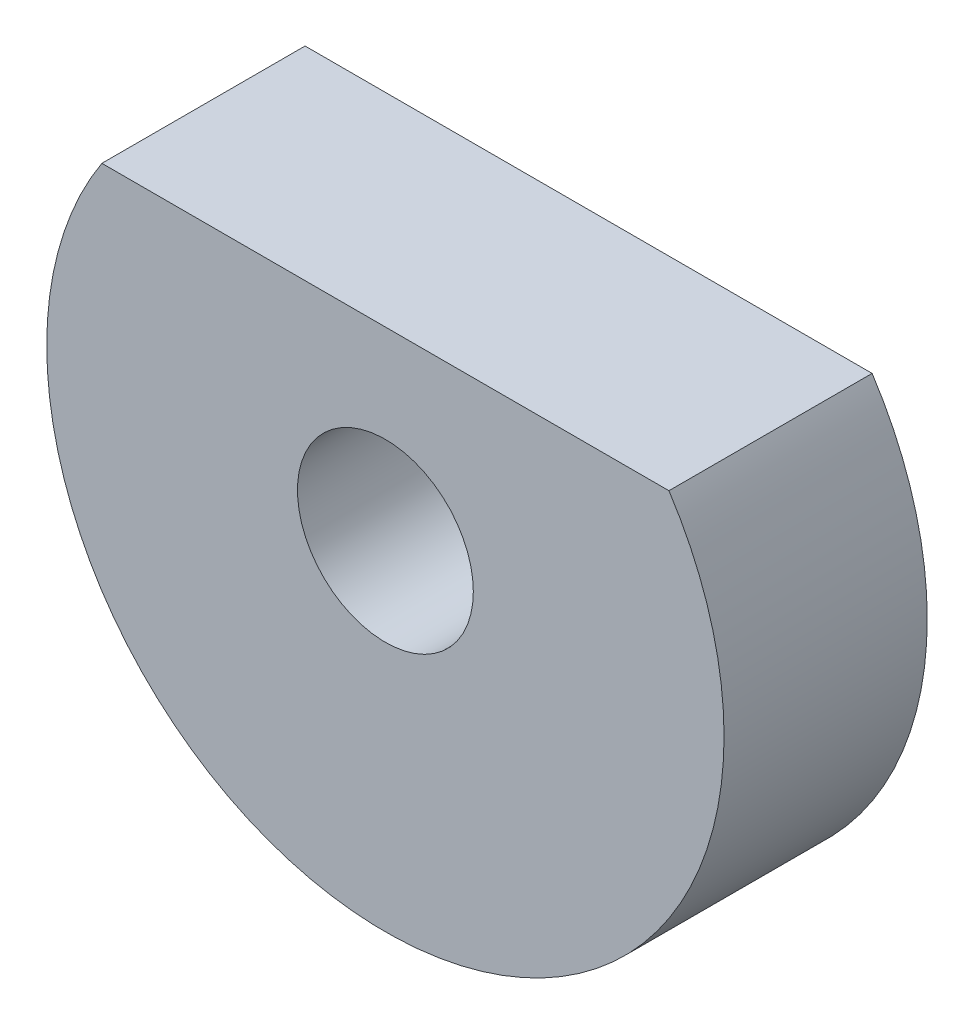
ISO-10303-21;
HEADER;
FILE_DESCRIPTION(('STEP AP214'),'2;1');
FILE_NAME('part.step','',(''),(''),'','','');
FILE_SCHEMA(('AUTOMOTIVE_DESIGN { 1 0 10303 214 1 1 1 1 }'));
ENDSEC;
DATA;
#1=APPLICATION_CONTEXT('core data for automotive mechanical design processes');
#2=APPLICATION_PROTOCOL_DEFINITION('international standard','automotive_design',2000,#1);
#3=PRODUCT_CONTEXT('',#1,'mechanical');
#4=PRODUCT('Part','Part','',(#3));
#5=PRODUCT_RELATED_PRODUCT_CATEGORY('part','',(#4));
#6=PRODUCT_DEFINITION_FORMATION('','',#4);
#7=PRODUCT_DEFINITION_CONTEXT('part definition',#1,'design');
#8=PRODUCT_DEFINITION('design','',#6,#7);
#9=PRODUCT_DEFINITION_SHAPE('','',#8);
#10=(LENGTH_UNIT() NAMED_UNIT(*) SI_UNIT(.MILLI.,.METRE.));
#11=(NAMED_UNIT(*) PLANE_ANGLE_UNIT() SI_UNIT($,.RADIAN.));
#12=(NAMED_UNIT(*) SI_UNIT($,.STERADIAN.) SOLID_ANGLE_UNIT());
#13=UNCERTAINTY_MEASURE_WITH_UNIT(LENGTH_MEASURE(1.E-05),#10,'distance_accuracy_value','');
#14=(GEOMETRIC_REPRESENTATION_CONTEXT(3) GLOBAL_UNCERTAINTY_ASSIGNED_CONTEXT((#13)) GLOBAL_UNIT_ASSIGNED_CONTEXT((#10,
#11,#12)) REPRESENTATION_CONTEXT('',''));
#15=CARTESIAN_POINT('',(0.,0.,0.));
#16=DIRECTION('',(0.,0.,1.));
#17=DIRECTION('',(1.,0.,0.));
#18=AXIS2_PLACEMENT_3D('',#15,#16,#17);
#19=CARTESIAN_POINT('',(0.,0.,1.5));
#20=DIRECTION('',(0.,0.,1.));
#21=DIRECTION('',(1.,0.,0.));
#22=AXIS2_PLACEMENT_3D('',#19,#20,#21);
#23=PLANE('',#22);
#24=CARTESIAN_POINT('',(0.,0.,1.5));
#25=DIRECTION('',(0.,0.,1.));
#26=DIRECTION('',(1.,0.,0.));
#27=AXIS2_PLACEMENT_3D('',#24,#25,#26);
#28=CIRCLE('',#27,2.5);
#29=CARTESIAN_POINT('',(-2.093018544172,1.36721372643494,1.5));
#30=VERTEX_POINT('',#29);
#31=CARTESIAN_POINT('',(2.093018544172,1.36721372643494,1.5));
#32=VERTEX_POINT('',#31);
#33=EDGE_CURVE('E72',#30,#32,#28,.T.);
#34=ORIENTED_EDGE('',*,*,#33,.T.);
#35=DIRECTION('',(-1.,0.,0.));
#36=VECTOR('',#35,1.);
#37=CARTESIAN_POINT('',(-2.093018544172,1.36721372643494,1.5));
#38=LINE('',#37,#36);
#39=EDGE_CURVE('E56',#32,#30,#38,.T.);
#40=ORIENTED_EDGE('',*,*,#39,.T.);
#41=EDGE_LOOP('',(#34,#40));
#42=FACE_BOUND('',#41,.T.);
#43=CARTESIAN_POINT('',(0.,0.,1.5));
#44=DIRECTION('',(0.,0.,1.));
#45=DIRECTION('',(1.,0.,0.));
#46=AXIS2_PLACEMENT_3D('',#43,#44,#45);
#47=CIRCLE('',#46,0.649141344840298);
#48=CARTESIAN_POINT('',(0.649141344840298,0.,1.5));
#49=VERTEX_POINT('',#48);
#50=EDGE_CURVE('E80',#49,#49,#47,.T.);
#51=ORIENTED_EDGE('',*,*,#50,.F.);
#52=EDGE_LOOP('',(#51));
#53=FACE_BOUND('',#52,.T.);
#54=ADVANCED_FACE('F39',(#42,#53),#23,.T.);
#55=CARTESIAN_POINT('',(0.,0.,0.));
#56=DIRECTION('',(0.,0.,1.));
#57=DIRECTION('',(1.,0.,0.));
#58=AXIS2_PLACEMENT_3D('',#55,#56,#57);
#59=PLANE('',#58);
#60=CARTESIAN_POINT('',(0.,0.,0.));
#61=DIRECTION('',(0.,0.,1.));
#62=DIRECTION('',(1.,0.,0.));
#63=AXIS2_PLACEMENT_3D('',#60,#61,#62);
#64=CIRCLE('',#63,2.5);
#65=CARTESIAN_POINT('',(-2.093018544172,1.36721372643494,0.));
#66=VERTEX_POINT('',#65);
#67=CARTESIAN_POINT('',(2.093018544172,1.36721372643494,0.));
#68=VERTEX_POINT('',#67);
#69=EDGE_CURVE('E73',#66,#68,#64,.T.);
#70=ORIENTED_EDGE('',*,*,#69,.F.);
#71=DIRECTION('',(-1.,0.,0.));
#72=VECTOR('',#71,1.);
#73=CARTESIAN_POINT('',(-2.093018544172,1.36721372643494,0.));
#74=LINE('',#73,#72);
#75=EDGE_CURVE('E64',#68,#66,#74,.T.);
#76=ORIENTED_EDGE('',*,*,#75,.F.);
#77=EDGE_LOOP('',(#70,#76));
#78=FACE_BOUND('',#77,.T.);
#79=CARTESIAN_POINT('',(0.,0.,0.));
#80=DIRECTION('',(0.,0.,1.));
#81=DIRECTION('',(1.,0.,0.));
#82=AXIS2_PLACEMENT_3D('',#79,#80,#81);
#83=CIRCLE('',#82,0.649141344840298);
#84=CARTESIAN_POINT('',(0.649141344840298,0.,0.));
#85=VERTEX_POINT('',#84);
#86=EDGE_CURVE('E84',#85,#85,#83,.T.);
#87=ORIENTED_EDGE('',*,*,#86,.T.);
#88=EDGE_LOOP('',(#87));
#89=FACE_BOUND('',#88,.T.);
#90=ADVANCED_FACE('F77',(#78,#89),#59,.F.);
#91=CARTESIAN_POINT('',(0.,0.,1.5));
#92=DIRECTION('',(0.,0.,-1.));
#93=DIRECTION('',(-1.,0.,0.));
#94=AXIS2_PLACEMENT_3D('',#91,#92,#93);
#95=CYLINDRICAL_SURFACE('',#94,2.5);
#96=ORIENTED_EDGE('',*,*,#69,.T.);
#97=DIRECTION('',(0.,0.,-1.));
#98=VECTOR('',#97,1.);
#99=CARTESIAN_POINT('',(2.093018544172,1.36721372643494,1.5));
#100=LINE('',#99,#98);
#101=EDGE_CURVE('E11',#32,#68,#100,.T.);
#102=ORIENTED_EDGE('',*,*,#101,.F.);
#103=ORIENTED_EDGE('',*,*,#33,.F.);
#104=DIRECTION('',(0.,0.,-1.));
#105=VECTOR('',#104,1.);
#106=CARTESIAN_POINT('',(-2.093018544172,1.36721372643494,1.5));
#107=LINE('',#106,#105);
#108=EDGE_CURVE('E49',#30,#66,#107,.T.);
#109=ORIENTED_EDGE('',*,*,#108,.T.);
#110=EDGE_LOOP('',(#96,#102,#103,#109));
#111=FACE_BOUND('',#110,.T.);
#112=ADVANCED_FACE('F41',(#111),#95,.T.);
#113=CARTESIAN_POINT('',(-2.093018544172,1.36721372643494,1.5));
#114=DIRECTION('',(0.,-1.,0.));
#115=DIRECTION('',(0.,0.,-1.));
#116=AXIS2_PLACEMENT_3D('',#113,#114,#115);
#117=PLANE('',#116);
#118=ORIENTED_EDGE('',*,*,#75,.T.);
#119=ORIENTED_EDGE('',*,*,#108,.F.);
#120=ORIENTED_EDGE('',*,*,#39,.F.);
#121=ORIENTED_EDGE('',*,*,#101,.T.);
#122=EDGE_LOOP('',(#118,#119,#120,#121));
#123=FACE_BOUND('',#122,.T.);
#124=ADVANCED_FACE('F67',(#123),#117,.F.);
#125=CARTESIAN_POINT('',(0.,0.,1.5));
#126=DIRECTION('',(0.,0.,-1.));
#127=DIRECTION('',(-1.,0.,0.));
#128=AXIS2_PLACEMENT_3D('',#125,#126,#127);
#129=CYLINDRICAL_SURFACE('',#128,0.649141344840298);
#130=ORIENTED_EDGE('',*,*,#50,.T.);
#131=EDGE_LOOP('',(#130));
#132=FACE_BOUND('',#131,.T.);
#133=ORIENTED_EDGE('',*,*,#86,.F.);
#134=EDGE_LOOP('',(#133));
#135=FACE_BOUND('',#134,.T.);
#136=ADVANCED_FACE('F95',(#132,#135),#129,.F.);
#137=CLOSED_SHELL('',(#54,#90,#112,#124,#136));
#138=MANIFOLD_SOLID_BREP('B2',#137);
#139=ADVANCED_BREP_SHAPE_REPRESENTATION('',(#18,#138),#14);
#140=SHAPE_DEFINITION_REPRESENTATION(#9,#139);
ENDSEC;
END-ISO-10303-21;
